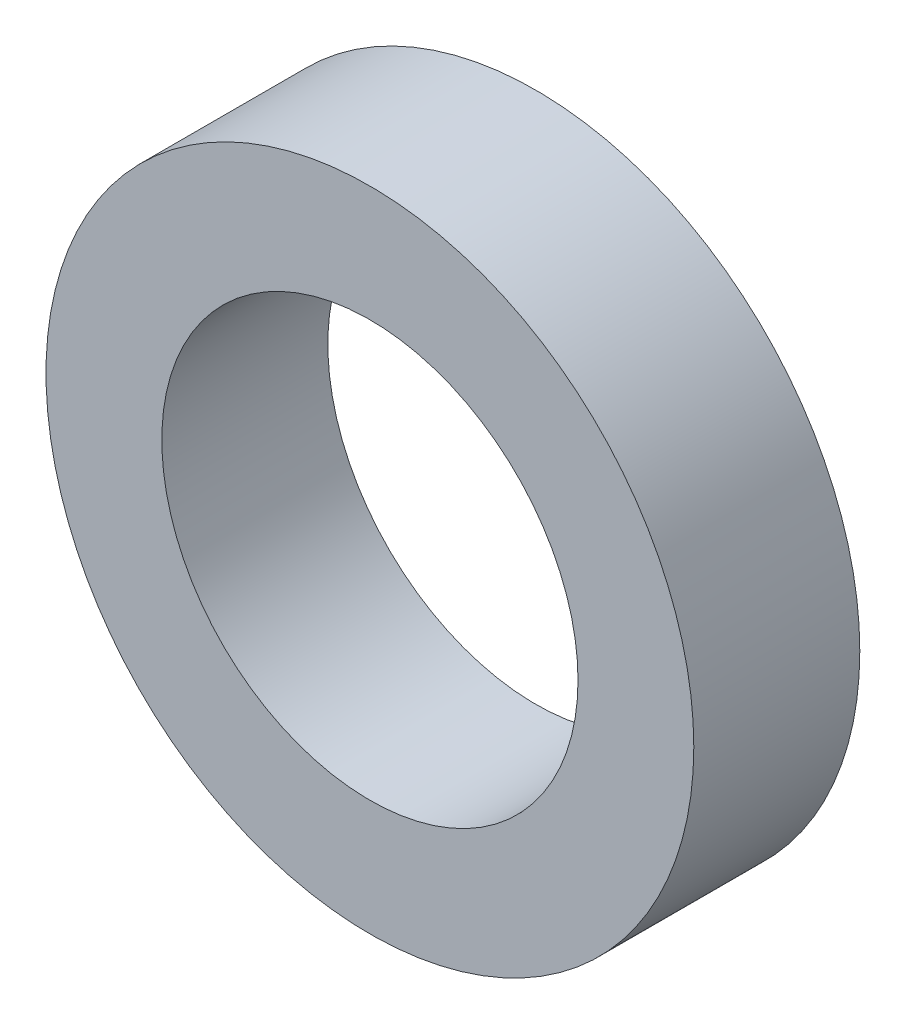
ISO-10303-21;
HEADER;
FILE_DESCRIPTION(('STEP AP214'),'2;1');
FILE_NAME('part.step','',(''),(''),'','','');
FILE_SCHEMA(('AUTOMOTIVE_DESIGN { 1 0 10303 214 1 1 1 1 }'));
ENDSEC;
DATA;
#1=APPLICATION_CONTEXT('core data for automotive mechanical design processes');
#2=APPLICATION_PROTOCOL_DEFINITION('international standard','automotive_design',2000,#1);
#3=PRODUCT_CONTEXT('',#1,'mechanical');
#4=PRODUCT('Part','Part','',(#3));
#5=PRODUCT_RELATED_PRODUCT_CATEGORY('part','',(#4));
#6=PRODUCT_DEFINITION_FORMATION('','',#4);
#7=PRODUCT_DEFINITION_CONTEXT('part definition',#1,'design');
#8=PRODUCT_DEFINITION('design','',#6,#7);
#9=PRODUCT_DEFINITION_SHAPE('','',#8);
#10=(LENGTH_UNIT() NAMED_UNIT(*) SI_UNIT(.MILLI.,.METRE.));
#11=(NAMED_UNIT(*) PLANE_ANGLE_UNIT() SI_UNIT($,.RADIAN.));
#12=(NAMED_UNIT(*) SI_UNIT($,.STERADIAN.) SOLID_ANGLE_UNIT());
#13=UNCERTAINTY_MEASURE_WITH_UNIT(LENGTH_MEASURE(1.E-05),#10,'distance_accuracy_value','');
#14=(GEOMETRIC_REPRESENTATION_CONTEXT(3) GLOBAL_UNCERTAINTY_ASSIGNED_CONTEXT((#13)) GLOBAL_UNIT_ASSIGNED_CONTEXT((#10,
#11,#12)) REPRESENTATION_CONTEXT('',''));
#15=CARTESIAN_POINT('',(0.,0.,0.));
#16=DIRECTION('',(0.,0.,1.));
#17=DIRECTION('',(1.,0.,0.));
#18=AXIS2_PLACEMENT_3D('',#15,#16,#17);
#19=CARTESIAN_POINT('',(0.,0.,2.6035));
#20=DIRECTION('',(0.,0.,1.));
#21=DIRECTION('',(1.,0.,0.));
#22=AXIS2_PLACEMENT_3D('',#19,#20,#21);
#23=PLANE('',#22);
#24=CARTESIAN_POINT('',(0.,0.,2.6035));
#25=DIRECTION('',(0.,0.,1.));
#26=DIRECTION('',(1.,0.,0.));
#27=AXIS2_PLACEMENT_3D('',#24,#25,#26);
#28=CIRCLE('',#27,5.08);
#29=CARTESIAN_POINT('',(5.08,0.,2.6035));
#30=VERTEX_POINT('',#29);
#31=EDGE_CURVE('E10',#30,#30,#28,.T.);
#32=ORIENTED_EDGE('',*,*,#31,.T.);
#33=EDGE_LOOP('',(#32));
#34=FACE_BOUND('',#33,.T.);
#35=CARTESIAN_POINT('',(0.,0.,2.6035));
#36=DIRECTION('',(0.,0.,1.));
#37=DIRECTION('',(1.,0.,0.));
#38=AXIS2_PLACEMENT_3D('',#35,#36,#37);
#39=CIRCLE('',#38,3.2639);
#40=CARTESIAN_POINT('',(3.2639,0.,2.6035));
#41=VERTEX_POINT('',#40);
#42=EDGE_CURVE('E56',#41,#41,#39,.T.);
#43=ORIENTED_EDGE('',*,*,#42,.F.);
#44=EDGE_LOOP('',(#43));
#45=FACE_BOUND('',#44,.T.);
#46=ADVANCED_FACE('F43',(#34,#45),#23,.T.);
#47=CARTESIAN_POINT('',(0.,0.,0.));
#48=DIRECTION('',(0.,0.,1.));
#49=DIRECTION('',(1.,0.,0.));
#50=AXIS2_PLACEMENT_3D('',#47,#48,#49);
#51=PLANE('',#50);
#52=CARTESIAN_POINT('',(0.,0.,0.));
#53=DIRECTION('',(0.,0.,1.));
#54=DIRECTION('',(1.,0.,0.));
#55=AXIS2_PLACEMENT_3D('',#52,#53,#54);
#56=CIRCLE('',#55,5.08);
#57=CARTESIAN_POINT('',(5.08,0.,0.));
#58=VERTEX_POINT('',#57);
#59=EDGE_CURVE('E47',#58,#58,#56,.T.);
#60=ORIENTED_EDGE('',*,*,#59,.F.);
#61=EDGE_LOOP('',(#60));
#62=FACE_BOUND('',#61,.T.);
#63=CARTESIAN_POINT('',(0.,0.,0.));
#64=DIRECTION('',(0.,0.,1.));
#65=DIRECTION('',(1.,0.,0.));
#66=AXIS2_PLACEMENT_3D('',#63,#64,#65);
#67=CIRCLE('',#66,3.2639);
#68=CARTESIAN_POINT('',(3.2639,0.,0.));
#69=VERTEX_POINT('',#68);
#70=EDGE_CURVE('E58',#69,#69,#67,.T.);
#71=ORIENTED_EDGE('',*,*,#70,.T.);
#72=EDGE_LOOP('',(#71));
#73=FACE_BOUND('',#72,.T.);
#74=ADVANCED_FACE('F70',(#62,#73),#51,.F.);
#75=CARTESIAN_POINT('',(0.,0.,2.6035));
#76=DIRECTION('',(0.,0.,-1.));
#77=DIRECTION('',(-1.,0.,0.));
#78=AXIS2_PLACEMENT_3D('',#75,#76,#77);
#79=CYLINDRICAL_SURFACE('',#78,5.08);
#80=ORIENTED_EDGE('',*,*,#31,.F.);
#81=EDGE_LOOP('',(#80));
#82=FACE_BOUND('',#81,.T.);
#83=ORIENTED_EDGE('',*,*,#59,.T.);
#84=EDGE_LOOP('',(#83));
#85=FACE_BOUND('',#84,.T.);
#86=ADVANCED_FACE('F45',(#82,#85),#79,.T.);
#87=CARTESIAN_POINT('',(0.,0.,2.6035));
#88=DIRECTION('',(0.,0.,-1.));
#89=DIRECTION('',(-1.,0.,0.));
#90=AXIS2_PLACEMENT_3D('',#87,#88,#89);
#91=CYLINDRICAL_SURFACE('',#90,3.2639);
#92=ORIENTED_EDGE('',*,*,#42,.T.);
#93=EDGE_LOOP('',(#92));
#94=FACE_BOUND('',#93,.T.);
#95=ORIENTED_EDGE('',*,*,#70,.F.);
#96=EDGE_LOOP('',(#95));
#97=FACE_BOUND('',#96,.T.);
#98=ADVANCED_FACE('F66',(#94,#97),#91,.F.);
#99=CLOSED_SHELL('',(#46,#74,#86,#98));
#100=MANIFOLD_SOLID_BREP('B2',#99);
#101=ADVANCED_BREP_SHAPE_REPRESENTATION('',(#18,#100),#14);
#102=SHAPE_DEFINITION_REPRESENTATION(#9,#101);
ENDSEC;
END-ISO-10303-21;
